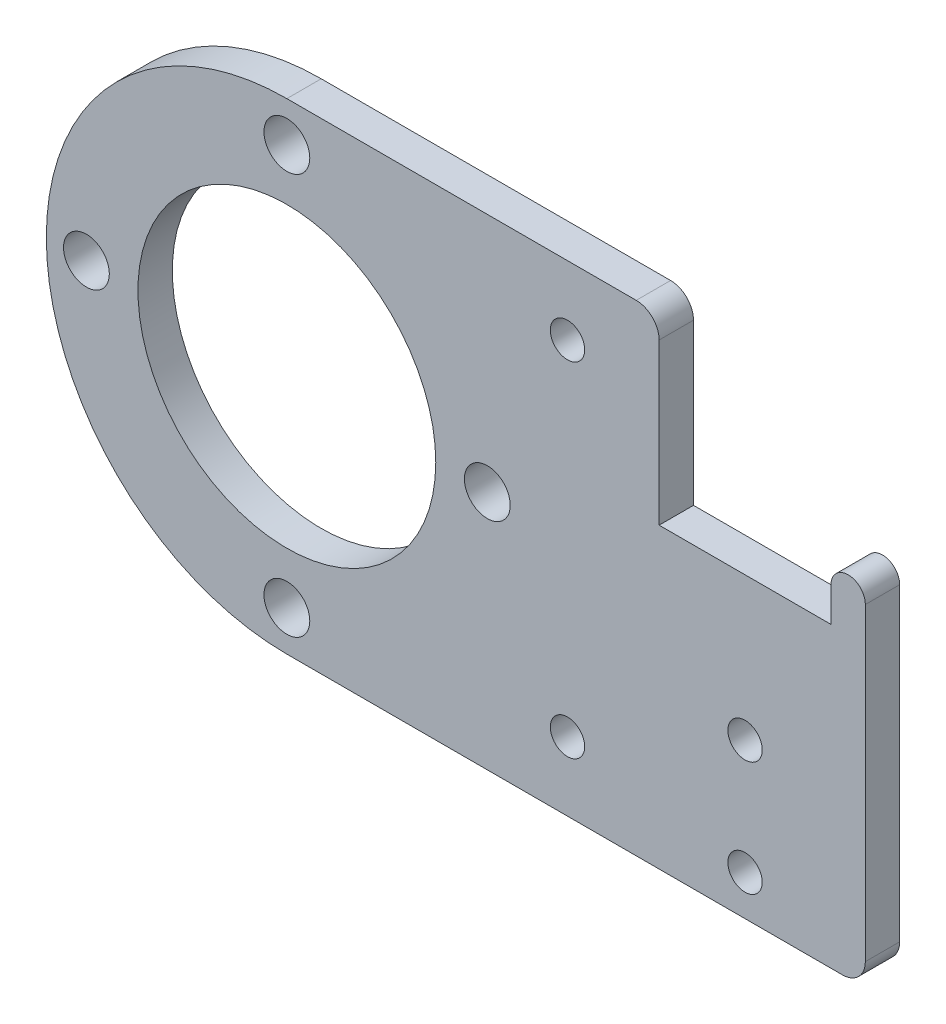
ISO-10303-21;
HEADER;
FILE_DESCRIPTION(('STEP AP214'),'2;1');
FILE_NAME('part.step','',(''),(''),'','','');
FILE_SCHEMA(('AUTOMOTIVE_DESIGN { 1 0 10303 214 1 1 1 1 }'));
ENDSEC;
DATA;
#1=APPLICATION_CONTEXT('core data for automotive mechanical design processes');
#2=APPLICATION_PROTOCOL_DEFINITION('international standard','automotive_design',2000,#1);
#3=PRODUCT_CONTEXT('',#1,'mechanical');
#4=PRODUCT('Part','Part','',(#3));
#5=PRODUCT_RELATED_PRODUCT_CATEGORY('part','',(#4));
#6=PRODUCT_DEFINITION_FORMATION('','',#4);
#7=PRODUCT_DEFINITION_CONTEXT('part definition',#1,'design');
#8=PRODUCT_DEFINITION('design','',#6,#7);
#9=PRODUCT_DEFINITION_SHAPE('','',#8);
#10=(LENGTH_UNIT() NAMED_UNIT(*) SI_UNIT(.MILLI.,.METRE.));
#11=(NAMED_UNIT(*) PLANE_ANGLE_UNIT() SI_UNIT($,.RADIAN.));
#12=(NAMED_UNIT(*) SI_UNIT($,.STERADIAN.) SOLID_ANGLE_UNIT());
#13=UNCERTAINTY_MEASURE_WITH_UNIT(LENGTH_MEASURE(1.E-05),#10,'distance_accuracy_value','');
#14=(GEOMETRIC_REPRESENTATION_CONTEXT(3) GLOBAL_UNCERTAINTY_ASSIGNED_CONTEXT((#13)) GLOBAL_UNIT_ASSIGNED_CONTEXT((#10,
#11,#12)) REPRESENTATION_CONTEXT('',''));
#15=CARTESIAN_POINT('',(0.,0.,0.));
#16=DIRECTION('',(0.,0.,1.));
#17=DIRECTION('',(1.,0.,0.));
#18=AXIS2_PLACEMENT_3D('',#15,#16,#17);
#19=CARTESIAN_POINT('',(0.,0.,3.));
#20=DIRECTION('',(0.,0.,1.));
#21=DIRECTION('',(1.,0.,0.));
#22=AXIS2_PLACEMENT_3D('',#19,#20,#21);
#23=PLANE('',#22);
#24=CARTESIAN_POINT('',(24.5,15.,3.));
#25=DIRECTION('',(0.,0.,1.));
#26=DIRECTION('',(1.,0.,0.));
#27=AXIS2_PLACEMENT_3D('',#24,#25,#26);
#28=CIRCLE('',#27,1.5);
#29=CARTESIAN_POINT('',(26.,15.,3.));
#30=VERTEX_POINT('',#29);
#31=EDGE_CURVE('E248',#30,#30,#28,.T.);
#32=ORIENTED_EDGE('',*,*,#31,.F.);
#33=EDGE_LOOP('',(#32));
#34=FACE_BOUND('',#33,.T.);
#35=CARTESIAN_POINT('',(40.,-7.5,3.));
#36=DIRECTION('',(0.,0.,1.));
#37=DIRECTION('',(1.,0.,0.));
#38=AXIS2_PLACEMENT_3D('',#35,#36,#37);
#39=CIRCLE('',#38,1.5);
#40=CARTESIAN_POINT('',(41.5,-7.5,3.));
#41=VERTEX_POINT('',#40);
#42=EDGE_CURVE('E236',#41,#41,#39,.T.);
#43=ORIENTED_EDGE('',*,*,#42,.F.);
#44=EDGE_LOOP('',(#43));
#45=FACE_BOUND('',#44,.T.);
#46=CARTESIAN_POINT('',(-17.5,0.,3.));
#47=DIRECTION('',(0.,0.,1.));
#48=DIRECTION('',(1.,0.,0.));
#49=AXIS2_PLACEMENT_3D('',#46,#47,#48);
#50=CIRCLE('',#49,2.);
#51=CARTESIAN_POINT('',(-15.5,0.,3.));
#52=VERTEX_POINT('',#51);
#53=EDGE_CURVE('E224',#52,#52,#50,.T.);
#54=ORIENTED_EDGE('',*,*,#53,.F.);
#55=EDGE_LOOP('',(#54));
#56=FACE_BOUND('',#55,.T.);
#57=CARTESIAN_POINT('',(17.5,0.,3.));
#58=DIRECTION('',(0.,0.,1.));
#59=DIRECTION('',(1.,0.,0.));
#60=AXIS2_PLACEMENT_3D('',#57,#58,#59);
#61=CIRCLE('',#60,2.);
#62=CARTESIAN_POINT('',(19.5,0.,3.));
#63=VERTEX_POINT('',#62);
#64=EDGE_CURVE('E212',#63,#63,#61,.T.);
#65=ORIENTED_EDGE('',*,*,#64,.F.);
#66=EDGE_LOOP('',(#65));
#67=FACE_BOUND('',#66,.T.);
#68=DIRECTION('',(1.,0.,0.));
#69=VECTOR('',#68,1.);
#70=CARTESIAN_POINT('',(50.5,-21.,3.));
#71=LINE('',#70,#69);
#72=CARTESIAN_POINT('',(0.,-21.,3.));
#73=VERTEX_POINT('',#72);
#74=CARTESIAN_POINT('',(48.5,-21.,3.));
#75=VERTEX_POINT('',#74);
#76=EDGE_CURVE('E112',#73,#75,#71,.T.);
#77=ORIENTED_EDGE('',*,*,#76,.T.);
#78=CARTESIAN_POINT('',(48.5,-19.,3.));
#79=DIRECTION('',(0.,0.,1.));
#80=DIRECTION('',(1.,0.,0.));
#81=AXIS2_PLACEMENT_3D('',#78,#79,#80);
#82=CIRCLE('',#81,2.);
#83=CARTESIAN_POINT('',(50.5,-19.,3.));
#84=VERTEX_POINT('',#83);
#85=EDGE_CURVE('E152',#75,#84,#82,.T.);
#86=ORIENTED_EDGE('',*,*,#85,.T.);
#87=DIRECTION('',(0.,1.,0.));
#88=VECTOR('',#87,1.);
#89=CARTESIAN_POINT('',(50.5,8.,3.));
#90=LINE('',#89,#88);
#91=CARTESIAN_POINT('',(50.5,8.,3.));
#92=VERTEX_POINT('',#91);
#93=EDGE_CURVE('E122',#84,#92,#90,.T.);
#94=ORIENTED_EDGE('',*,*,#93,.T.);
#95=CARTESIAN_POINT('',(49.,8.,3.));
#96=DIRECTION('',(0.,0.,1.));
#97=DIRECTION('',(-1.,0.,0.));
#98=AXIS2_PLACEMENT_3D('',#95,#96,#97);
#99=CIRCLE('',#98,1.5);
#100=CARTESIAN_POINT('',(47.5,8.,3.));
#101=VERTEX_POINT('',#100);
#102=EDGE_CURVE('E206',#92,#101,#99,.T.);
#103=ORIENTED_EDGE('',*,*,#102,.T.);
#104=DIRECTION('',(0.,-1.,0.));
#105=VECTOR('',#104,1.);
#106=CARTESIAN_POINT('',(47.5,5.,3.));
#107=LINE('',#106,#105);
#108=CARTESIAN_POINT('',(47.5,5.,3.));
#109=VERTEX_POINT('',#108);
#110=EDGE_CURVE('E185',#101,#109,#107,.T.);
#111=ORIENTED_EDGE('',*,*,#110,.T.);
#112=DIRECTION('',(-1.,0.,0.));
#113=VECTOR('',#112,1.);
#114=CARTESIAN_POINT('',(32.5,5.,3.));
#115=LINE('',#114,#113);
#116=CARTESIAN_POINT('',(32.5,5.,3.));
#117=VERTEX_POINT('',#116);
#118=EDGE_CURVE('E203',#109,#117,#115,.T.);
#119=ORIENTED_EDGE('',*,*,#118,.T.);
#120=DIRECTION('',(0.,1.,0.));
#121=VECTOR('',#120,1.);
#122=CARTESIAN_POINT('',(32.5,21.,3.));
#123=LINE('',#122,#121);
#124=CARTESIAN_POINT('',(32.5,19.,3.));
#125=VERTEX_POINT('',#124);
#126=EDGE_CURVE('E201',#117,#125,#123,.T.);
#127=ORIENTED_EDGE('',*,*,#126,.T.);
#128=CARTESIAN_POINT('',(30.5,19.,3.));
#129=DIRECTION('',(0.,0.,1.));
#130=DIRECTION('',(1.,0.,0.));
#131=AXIS2_PLACEMENT_3D('',#128,#129,#130);
#132=CIRCLE('',#131,2.);
#133=CARTESIAN_POINT('',(30.5,21.,3.));
#134=VERTEX_POINT('',#133);
#135=EDGE_CURVE('E50',#125,#134,#132,.T.);
#136=ORIENTED_EDGE('',*,*,#135,.T.);
#137=DIRECTION('',(-1.,0.,0.));
#138=VECTOR('',#137,1.);
#139=CARTESIAN_POINT('',(0.,21.,3.));
#140=LINE('',#139,#138);
#141=CARTESIAN_POINT('',(0.,21.,3.));
#142=VERTEX_POINT('',#141);
#143=EDGE_CURVE('E127',#134,#142,#140,.T.);
#144=ORIENTED_EDGE('',*,*,#143,.T.);
#145=CARTESIAN_POINT('',(0.,0.,3.));
#146=DIRECTION('',(0.,0.,1.));
#147=DIRECTION('',(1.,0.,0.));
#148=AXIS2_PLACEMENT_3D('',#145,#146,#147);
#149=CIRCLE('',#148,21.);
#150=EDGE_CURVE('E123',#142,#73,#149,.T.);
#151=ORIENTED_EDGE('',*,*,#150,.T.);
#152=EDGE_LOOP('',(#77,#86,#94,#103,#111,#119,#127,#136,#144,#151));
#153=FACE_BOUND('',#152,.T.);
#154=CARTESIAN_POINT('',(0.,0.,3.));
#155=DIRECTION('',(0.,0.,1.));
#156=DIRECTION('',(1.,0.,0.));
#157=AXIS2_PLACEMENT_3D('',#154,#155,#156);
#158=CIRCLE('',#157,13.);
#159=CARTESIAN_POINT('',(13.,0.,3.));
#160=VERTEX_POINT('',#159);
#161=EDGE_CURVE('E199',#160,#160,#158,.T.);
#162=ORIENTED_EDGE('',*,*,#161,.F.);
#163=EDGE_LOOP('',(#162));
#164=FACE_BOUND('',#163,.T.);
#165=CARTESIAN_POINT('',(0.,-17.5,3.));
#166=DIRECTION('',(0.,0.,1.));
#167=DIRECTION('',(1.,0.,0.));
#168=AXIS2_PLACEMENT_3D('',#165,#166,#167);
#169=CIRCLE('',#168,2.);
#170=CARTESIAN_POINT('',(2.,-17.5,3.));
#171=VERTEX_POINT('',#170);
#172=EDGE_CURVE('E218',#171,#171,#169,.T.);
#173=ORIENTED_EDGE('',*,*,#172,.F.);
#174=EDGE_LOOP('',(#173));
#175=FACE_BOUND('',#174,.T.);
#176=CARTESIAN_POINT('',(0.,17.5,3.));
#177=DIRECTION('',(0.,0.,1.));
#178=DIRECTION('',(1.,0.,0.));
#179=AXIS2_PLACEMENT_3D('',#176,#177,#178);
#180=CIRCLE('',#179,2.);
#181=CARTESIAN_POINT('',(2.,17.5,3.));
#182=VERTEX_POINT('',#181);
#183=EDGE_CURVE('E230',#182,#182,#180,.T.);
#184=ORIENTED_EDGE('',*,*,#183,.F.);
#185=EDGE_LOOP('',(#184));
#186=FACE_BOUND('',#185,.T.);
#187=CARTESIAN_POINT('',(40.,-17.5,3.));
#188=DIRECTION('',(0.,0.,1.));
#189=DIRECTION('',(1.,0.,0.));
#190=AXIS2_PLACEMENT_3D('',#187,#188,#189);
#191=CIRCLE('',#190,1.5);
#192=CARTESIAN_POINT('',(41.5,-17.5,3.));
#193=VERTEX_POINT('',#192);
#194=EDGE_CURVE('E242',#193,#193,#191,.T.);
#195=ORIENTED_EDGE('',*,*,#194,.F.);
#196=EDGE_LOOP('',(#195));
#197=FACE_BOUND('',#196,.T.);
#198=CARTESIAN_POINT('',(24.5,-15.,3.));
#199=DIRECTION('',(0.,0.,1.));
#200=DIRECTION('',(1.,0.,0.));
#201=AXIS2_PLACEMENT_3D('',#198,#199,#200);
#202=CIRCLE('',#201,1.5);
#203=CARTESIAN_POINT('',(26.,-15.,3.));
#204=VERTEX_POINT('',#203);
#205=EDGE_CURVE('E254',#204,#204,#202,.T.);
#206=ORIENTED_EDGE('',*,*,#205,.F.);
#207=EDGE_LOOP('',(#206));
#208=FACE_BOUND('',#207,.T.);
#209=ADVANCED_FACE('F35',(#34,#45,#56,#67,#153,#164,#175,#186,#197,#208),#23,.T.);
#210=CARTESIAN_POINT('',(0.,0.,0.));
#211=DIRECTION('',(0.,0.,1.));
#212=DIRECTION('',(1.,0.,0.));
#213=AXIS2_PLACEMENT_3D('',#210,#211,#212);
#214=PLANE('',#213);
#215=DIRECTION('',(0.,1.,0.));
#216=VECTOR('',#215,1.);
#217=CARTESIAN_POINT('',(50.5,8.,0.));
#218=LINE('',#217,#216);
#219=CARTESIAN_POINT('',(50.5,-19.,0.));
#220=VERTEX_POINT('',#219);
#221=CARTESIAN_POINT('',(50.5,8.,0.));
#222=VERTEX_POINT('',#221);
#223=EDGE_CURVE('E192',#220,#222,#218,.T.);
#224=ORIENTED_EDGE('',*,*,#223,.F.);
#225=CARTESIAN_POINT('',(48.5,-19.,0.));
#226=DIRECTION('',(0.,0.,1.));
#227=DIRECTION('',(1.,0.,0.));
#228=AXIS2_PLACEMENT_3D('',#225,#226,#227);
#229=CIRCLE('',#228,2.);
#230=CARTESIAN_POINT('',(48.5,-21.,0.));
#231=VERTEX_POINT('',#230);
#232=EDGE_CURVE('E148',#220,#231,#229,.F.);
#233=ORIENTED_EDGE('',*,*,#232,.T.);
#234=DIRECTION('',(1.,0.,0.));
#235=VECTOR('',#234,1.);
#236=CARTESIAN_POINT('',(50.5,-21.,0.));
#237=LINE('',#236,#235);
#238=CARTESIAN_POINT('',(0.,-21.,0.));
#239=VERTEX_POINT('',#238);
#240=EDGE_CURVE('E196',#239,#231,#237,.T.);
#241=ORIENTED_EDGE('',*,*,#240,.F.);
#242=CARTESIAN_POINT('',(0.,0.,0.));
#243=DIRECTION('',(0.,0.,1.));
#244=DIRECTION('',(1.,0.,0.));
#245=AXIS2_PLACEMENT_3D('',#242,#243,#244);
#246=CIRCLE('',#245,21.);
#247=CARTESIAN_POINT('',(0.,21.,0.));
#248=VERTEX_POINT('',#247);
#249=EDGE_CURVE('E135',#248,#239,#246,.T.);
#250=ORIENTED_EDGE('',*,*,#249,.F.);
#251=DIRECTION('',(-1.,0.,0.));
#252=VECTOR('',#251,1.);
#253=CARTESIAN_POINT('',(0.,21.,0.));
#254=LINE('',#253,#252);
#255=CARTESIAN_POINT('',(30.5,21.,0.));
#256=VERTEX_POINT('',#255);
#257=EDGE_CURVE('E131',#256,#248,#254,.T.);
#258=ORIENTED_EDGE('',*,*,#257,.F.);
#259=CARTESIAN_POINT('',(30.5,19.,0.));
#260=DIRECTION('',(0.,0.,1.));
#261=DIRECTION('',(1.,0.,0.));
#262=AXIS2_PLACEMENT_3D('',#259,#260,#261);
#263=CIRCLE('',#262,2.);
#264=CARTESIAN_POINT('',(32.5,19.,0.));
#265=VERTEX_POINT('',#264);
#266=EDGE_CURVE('E140',#256,#265,#263,.F.);
#267=ORIENTED_EDGE('',*,*,#266,.T.);
#268=DIRECTION('',(0.,1.,0.));
#269=VECTOR('',#268,1.);
#270=CARTESIAN_POINT('',(32.5,21.,0.));
#271=LINE('',#270,#269);
#272=CARTESIAN_POINT('',(32.5,5.,0.));
#273=VERTEX_POINT('',#272);
#274=EDGE_CURVE('E164',#273,#265,#271,.T.);
#275=ORIENTED_EDGE('',*,*,#274,.F.);
#276=DIRECTION('',(-1.,0.,0.));
#277=VECTOR('',#276,1.);
#278=CARTESIAN_POINT('',(32.5,5.,0.));
#279=LINE('',#278,#277);
#280=CARTESIAN_POINT('',(47.5,5.,0.));
#281=VERTEX_POINT('',#280);
#282=EDGE_CURVE('E166',#281,#273,#279,.T.);
#283=ORIENTED_EDGE('',*,*,#282,.F.);
#284=DIRECTION('',(0.,-1.,0.));
#285=VECTOR('',#284,1.);
#286=CARTESIAN_POINT('',(47.5,5.,0.));
#287=LINE('',#286,#285);
#288=CARTESIAN_POINT('',(47.5,8.,0.));
#289=VERTEX_POINT('',#288);
#290=EDGE_CURVE('E184',#289,#281,#287,.T.);
#291=ORIENTED_EDGE('',*,*,#290,.F.);
#292=CARTESIAN_POINT('',(49.,8.,0.));
#293=DIRECTION('',(0.,0.,1.));
#294=DIRECTION('',(-1.,0.,0.));
#295=AXIS2_PLACEMENT_3D('',#292,#293,#294);
#296=CIRCLE('',#295,1.5);
#297=EDGE_CURVE('E190',#222,#289,#296,.T.);
#298=ORIENTED_EDGE('',*,*,#297,.F.);
#299=EDGE_LOOP('',(#224,#233,#241,#250,#258,#267,#275,#283,#291,#298));
#300=FACE_BOUND('',#299,.T.);
#301=CARTESIAN_POINT('',(0.,0.,0.));
#302=DIRECTION('',(0.,0.,1.));
#303=DIRECTION('',(1.,0.,0.));
#304=AXIS2_PLACEMENT_3D('',#301,#302,#303);
#305=CIRCLE('',#304,13.);
#306=CARTESIAN_POINT('',(13.,0.,0.));
#307=VERTEX_POINT('',#306);
#308=EDGE_CURVE('E209',#307,#307,#305,.T.);
#309=ORIENTED_EDGE('',*,*,#308,.T.);
#310=EDGE_LOOP('',(#309));
#311=FACE_BOUND('',#310,.T.);
#312=CARTESIAN_POINT('',(17.5,0.,0.));
#313=DIRECTION('',(0.,0.,1.));
#314=DIRECTION('',(1.,0.,0.));
#315=AXIS2_PLACEMENT_3D('',#312,#313,#314);
#316=CIRCLE('',#315,2.);
#317=CARTESIAN_POINT('',(19.5,0.,0.));
#318=VERTEX_POINT('',#317);
#319=EDGE_CURVE('E215',#318,#318,#316,.T.);
#320=ORIENTED_EDGE('',*,*,#319,.T.);
#321=EDGE_LOOP('',(#320));
#322=FACE_BOUND('',#321,.T.);
#323=CARTESIAN_POINT('',(0.,-17.5,0.));
#324=DIRECTION('',(0.,0.,1.));
#325=DIRECTION('',(1.,0.,0.));
#326=AXIS2_PLACEMENT_3D('',#323,#324,#325);
#327=CIRCLE('',#326,2.);
#328=CARTESIAN_POINT('',(2.,-17.5,0.));
#329=VERTEX_POINT('',#328);
#330=EDGE_CURVE('E221',#329,#329,#327,.T.);
#331=ORIENTED_EDGE('',*,*,#330,.T.);
#332=EDGE_LOOP('',(#331));
#333=FACE_BOUND('',#332,.T.);
#334=CARTESIAN_POINT('',(-17.5,0.,0.));
#335=DIRECTION('',(0.,0.,1.));
#336=DIRECTION('',(1.,0.,0.));
#337=AXIS2_PLACEMENT_3D('',#334,#335,#336);
#338=CIRCLE('',#337,2.);
#339=CARTESIAN_POINT('',(-15.5,0.,0.));
#340=VERTEX_POINT('',#339);
#341=EDGE_CURVE('E227',#340,#340,#338,.T.);
#342=ORIENTED_EDGE('',*,*,#341,.T.);
#343=EDGE_LOOP('',(#342));
#344=FACE_BOUND('',#343,.T.);
#345=CARTESIAN_POINT('',(0.,17.5,0.));
#346=DIRECTION('',(0.,0.,1.));
#347=DIRECTION('',(1.,0.,0.));
#348=AXIS2_PLACEMENT_3D('',#345,#346,#347);
#349=CIRCLE('',#348,2.);
#350=CARTESIAN_POINT('',(2.,17.5,0.));
#351=VERTEX_POINT('',#350);
#352=EDGE_CURVE('E233',#351,#351,#349,.T.);
#353=ORIENTED_EDGE('',*,*,#352,.T.);
#354=EDGE_LOOP('',(#353));
#355=FACE_BOUND('',#354,.T.);
#356=CARTESIAN_POINT('',(40.,-7.5,0.));
#357=DIRECTION('',(0.,0.,1.));
#358=DIRECTION('',(1.,0.,0.));
#359=AXIS2_PLACEMENT_3D('',#356,#357,#358);
#360=CIRCLE('',#359,1.5);
#361=CARTESIAN_POINT('',(41.5,-7.5,0.));
#362=VERTEX_POINT('',#361);
#363=EDGE_CURVE('E239',#362,#362,#360,.T.);
#364=ORIENTED_EDGE('',*,*,#363,.T.);
#365=EDGE_LOOP('',(#364));
#366=FACE_BOUND('',#365,.T.);
#367=CARTESIAN_POINT('',(40.,-17.5,0.));
#368=DIRECTION('',(0.,0.,1.));
#369=DIRECTION('',(1.,0.,0.));
#370=AXIS2_PLACEMENT_3D('',#367,#368,#369);
#371=CIRCLE('',#370,1.5);
#372=CARTESIAN_POINT('',(41.5,-17.5,0.));
#373=VERTEX_POINT('',#372);
#374=EDGE_CURVE('E245',#373,#373,#371,.T.);
#375=ORIENTED_EDGE('',*,*,#374,.T.);
#376=EDGE_LOOP('',(#375));
#377=FACE_BOUND('',#376,.T.);
#378=CARTESIAN_POINT('',(24.5,15.,0.));
#379=DIRECTION('',(0.,0.,1.));
#380=DIRECTION('',(1.,0.,0.));
#381=AXIS2_PLACEMENT_3D('',#378,#379,#380);
#382=CIRCLE('',#381,1.5);
#383=CARTESIAN_POINT('',(26.,15.,0.));
#384=VERTEX_POINT('',#383);
#385=EDGE_CURVE('E251',#384,#384,#382,.T.);
#386=ORIENTED_EDGE('',*,*,#385,.T.);
#387=EDGE_LOOP('',(#386));
#388=FACE_BOUND('',#387,.T.);
#389=CARTESIAN_POINT('',(24.5,-15.,0.));
#390=DIRECTION('',(0.,0.,1.));
#391=DIRECTION('',(1.,0.,0.));
#392=AXIS2_PLACEMENT_3D('',#389,#390,#391);
#393=CIRCLE('',#392,1.5);
#394=CARTESIAN_POINT('',(26.,-15.,0.));
#395=VERTEX_POINT('',#394);
#396=EDGE_CURVE('E257',#395,#395,#393,.T.);
#397=ORIENTED_EDGE('',*,*,#396,.T.);
#398=EDGE_LOOP('',(#397));
#399=FACE_BOUND('',#398,.T.);
#400=ADVANCED_FACE('F161',(#300,#311,#322,#333,#344,#355,#366,#377,#388,#399),#214,.F.);
#401=CARTESIAN_POINT('',(0.,0.,3.));
#402=DIRECTION('',(0.,0.,-1.));
#403=DIRECTION('',(-1.,0.,0.));
#404=AXIS2_PLACEMENT_3D('',#401,#402,#403);
#405=CYLINDRICAL_SURFACE('',#404,21.);
#406=ORIENTED_EDGE('',*,*,#249,.T.);
#407=DIRECTION('',(0.,0.,-1.));
#408=VECTOR('',#407,1.);
#409=CARTESIAN_POINT('',(0.,-21.,3.));
#410=LINE('',#409,#408);
#411=EDGE_CURVE('E117',#73,#239,#410,.T.);
#412=ORIENTED_EDGE('',*,*,#411,.F.);
#413=ORIENTED_EDGE('',*,*,#150,.F.);
#414=DIRECTION('',(0.,0.,-1.));
#415=VECTOR('',#414,1.);
#416=CARTESIAN_POINT('',(0.,21.,3.));
#417=LINE('',#416,#415);
#418=EDGE_CURVE('E170',#142,#248,#417,.T.);
#419=ORIENTED_EDGE('',*,*,#418,.T.);
#420=EDGE_LOOP('',(#406,#412,#413,#419));
#421=FACE_BOUND('',#420,.T.);
#422=ADVANCED_FACE('F133',(#421),#405,.T.);
#423=CARTESIAN_POINT('',(50.5,-21.,3.));
#424=DIRECTION('',(0.,1.,0.));
#425=DIRECTION('',(-1.,0.,0.));
#426=AXIS2_PLACEMENT_3D('',#423,#424,#425);
#427=PLANE('',#426);
#428=ORIENTED_EDGE('',*,*,#240,.T.);
#429=DIRECTION('',(0.,0.,-1.));
#430=VECTOR('',#429,1.);
#431=CARTESIAN_POINT('',(48.5,-21.,3.));
#432=LINE('',#431,#430);
#433=EDGE_CURVE('E120',#231,#75,#432,.F.);
#434=ORIENTED_EDGE('',*,*,#433,.T.);
#435=ORIENTED_EDGE('',*,*,#76,.F.);
#436=ORIENTED_EDGE('',*,*,#411,.T.);
#437=EDGE_LOOP('',(#428,#434,#435,#436));
#438=FACE_BOUND('',#437,.T.);
#439=ADVANCED_FACE('F115',(#438),#427,.F.);
#440=CARTESIAN_POINT('',(50.5,8.,3.));
#441=DIRECTION('',(-1.,0.,0.));
#442=DIRECTION('',(0.,-1.,0.));
#443=AXIS2_PLACEMENT_3D('',#440,#441,#442);
#444=PLANE('',#443);
#445=ORIENTED_EDGE('',*,*,#93,.F.);
#446=DIRECTION('',(0.,0.,-1.));
#447=VECTOR('',#446,1.);
#448=CARTESIAN_POINT('',(50.5,-19.,3.));
#449=LINE('',#448,#447);
#450=EDGE_CURVE('E136',#84,#220,#449,.T.);
#451=ORIENTED_EDGE('',*,*,#450,.T.);
#452=ORIENTED_EDGE('',*,*,#223,.T.);
#453=DIRECTION('',(0.,0.,-1.));
#454=VECTOR('',#453,1.);
#455=CARTESIAN_POINT('',(50.5,8.,3.));
#456=LINE('',#455,#454);
#457=EDGE_CURVE('E137',#92,#222,#456,.T.);
#458=ORIENTED_EDGE('',*,*,#457,.F.);
#459=EDGE_LOOP('',(#445,#451,#452,#458));
#460=FACE_BOUND('',#459,.T.);
#461=ADVANCED_FACE('F293',(#460),#444,.F.);
#462=CARTESIAN_POINT('',(49.,8.,3.));
#463=DIRECTION('',(0.,0.,-1.));
#464=DIRECTION('',(-1.,0.,0.));
#465=AXIS2_PLACEMENT_3D('',#462,#463,#464);
#466=CYLINDRICAL_SURFACE('',#465,1.5);
#467=ORIENTED_EDGE('',*,*,#297,.T.);
#468=DIRECTION('',(0.,0.,-1.));
#469=VECTOR('',#468,1.);
#470=CARTESIAN_POINT('',(47.5,8.,3.));
#471=LINE('',#470,#469);
#472=EDGE_CURVE('E143',#101,#289,#471,.T.);
#473=ORIENTED_EDGE('',*,*,#472,.F.);
#474=ORIENTED_EDGE('',*,*,#102,.F.);
#475=ORIENTED_EDGE('',*,*,#457,.T.);
#476=EDGE_LOOP('',(#467,#473,#474,#475));
#477=FACE_BOUND('',#476,.T.);
#478=ADVANCED_FACE('F290',(#477),#466,.T.);
#479=CARTESIAN_POINT('',(47.5,5.,3.));
#480=DIRECTION('',(1.,0.,0.));
#481=DIRECTION('',(0.,1.,0.));
#482=AXIS2_PLACEMENT_3D('',#479,#480,#481);
#483=PLANE('',#482);
#484=ORIENTED_EDGE('',*,*,#290,.T.);
#485=DIRECTION('',(0.,0.,-1.));
#486=VECTOR('',#485,1.);
#487=CARTESIAN_POINT('',(47.5,5.,3.));
#488=LINE('',#487,#486);
#489=EDGE_CURVE('E175',#109,#281,#488,.T.);
#490=ORIENTED_EDGE('',*,*,#489,.F.);
#491=ORIENTED_EDGE('',*,*,#110,.F.);
#492=ORIENTED_EDGE('',*,*,#472,.T.);
#493=EDGE_LOOP('',(#484,#490,#491,#492));
#494=FACE_BOUND('',#493,.T.);
#495=ADVANCED_FACE('F182',(#494),#483,.F.);
#496=CARTESIAN_POINT('',(32.5,5.,3.));
#497=DIRECTION('',(0.,-1.,0.));
#498=DIRECTION('',(1.,0.,0.));
#499=AXIS2_PLACEMENT_3D('',#496,#497,#498);
#500=PLANE('',#499);
#501=ORIENTED_EDGE('',*,*,#282,.T.);
#502=DIRECTION('',(0.,0.,-1.));
#503=VECTOR('',#502,1.);
#504=CARTESIAN_POINT('',(32.5,5.,3.));
#505=LINE('',#504,#503);
#506=EDGE_CURVE('E172',#117,#273,#505,.T.);
#507=ORIENTED_EDGE('',*,*,#506,.F.);
#508=ORIENTED_EDGE('',*,*,#118,.F.);
#509=ORIENTED_EDGE('',*,*,#489,.T.);
#510=EDGE_LOOP('',(#501,#507,#508,#509));
#511=FACE_BOUND('',#510,.T.);
#512=ADVANCED_FACE('F284',(#511),#500,.F.);
#513=CARTESIAN_POINT('',(32.5,21.,3.));
#514=DIRECTION('',(-1.,0.,0.));
#515=DIRECTION('',(0.,0.,1.));
#516=AXIS2_PLACEMENT_3D('',#513,#514,#515);
#517=PLANE('',#516);
#518=ORIENTED_EDGE('',*,*,#274,.T.);
#519=DIRECTION('',(0.,0.,-1.));
#520=VECTOR('',#519,1.);
#521=CARTESIAN_POINT('',(32.5,19.,3.));
#522=LINE('',#521,#520);
#523=EDGE_CURVE('E11',#265,#125,#522,.F.);
#524=ORIENTED_EDGE('',*,*,#523,.T.);
#525=ORIENTED_EDGE('',*,*,#126,.F.);
#526=ORIENTED_EDGE('',*,*,#506,.T.);
#527=EDGE_LOOP('',(#518,#524,#525,#526));
#528=FACE_BOUND('',#527,.T.);
#529=ADVANCED_FACE('F281',(#528),#517,.F.);
#530=CARTESIAN_POINT('',(0.,21.,3.));
#531=DIRECTION('',(0.,-1.,0.));
#532=DIRECTION('',(1.,0.,0.));
#533=AXIS2_PLACEMENT_3D('',#530,#531,#532);
#534=PLANE('',#533);
#535=ORIENTED_EDGE('',*,*,#143,.F.);
#536=DIRECTION('',(0.,0.,-1.));
#537=VECTOR('',#536,1.);
#538=CARTESIAN_POINT('',(30.5,21.,3.));
#539=LINE('',#538,#537);
#540=EDGE_CURVE('E43',#134,#256,#539,.T.);
#541=ORIENTED_EDGE('',*,*,#540,.T.);
#542=ORIENTED_EDGE('',*,*,#257,.T.);
#543=ORIENTED_EDGE('',*,*,#418,.F.);
#544=EDGE_LOOP('',(#535,#541,#542,#543));
#545=FACE_BOUND('',#544,.T.);
#546=ADVANCED_FACE('F157',(#545),#534,.F.);
#547=CARTESIAN_POINT('',(0.,0.,3.));
#548=DIRECTION('',(0.,0.,-1.));
#549=DIRECTION('',(-1.,0.,0.));
#550=AXIS2_PLACEMENT_3D('',#547,#548,#549);
#551=CYLINDRICAL_SURFACE('',#550,13.);
#552=ORIENTED_EDGE('',*,*,#161,.T.);
#553=EDGE_LOOP('',(#552));
#554=FACE_BOUND('',#553,.T.);
#555=ORIENTED_EDGE('',*,*,#308,.F.);
#556=EDGE_LOOP('',(#555));
#557=FACE_BOUND('',#556,.T.);
#558=ADVANCED_FACE('F276',(#554,#557),#551,.F.);
#559=CARTESIAN_POINT('',(17.5,0.,3.));
#560=DIRECTION('',(0.,0.,-1.));
#561=DIRECTION('',(-1.,0.,0.));
#562=AXIS2_PLACEMENT_3D('',#559,#560,#561);
#563=CYLINDRICAL_SURFACE('',#562,2.);
#564=ORIENTED_EDGE('',*,*,#64,.T.);
#565=EDGE_LOOP('',(#564));
#566=FACE_BOUND('',#565,.T.);
#567=ORIENTED_EDGE('',*,*,#319,.F.);
#568=EDGE_LOOP('',(#567));
#569=FACE_BOUND('',#568,.T.);
#570=ADVANCED_FACE('F338',(#566,#569),#563,.F.);
#571=CARTESIAN_POINT('',(0.,-17.5,3.));
#572=DIRECTION('',(0.,0.,-1.));
#573=DIRECTION('',(-1.,0.,0.));
#574=AXIS2_PLACEMENT_3D('',#571,#572,#573);
#575=CYLINDRICAL_SURFACE('',#574,2.);
#576=ORIENTED_EDGE('',*,*,#172,.T.);
#577=EDGE_LOOP('',(#576));
#578=FACE_BOUND('',#577,.T.);
#579=ORIENTED_EDGE('',*,*,#330,.F.);
#580=EDGE_LOOP('',(#579));
#581=FACE_BOUND('',#580,.T.);
#582=ADVANCED_FACE('F335',(#578,#581),#575,.F.);
#583=CARTESIAN_POINT('',(-17.5,0.,3.));
#584=DIRECTION('',(0.,0.,-1.));
#585=DIRECTION('',(-1.,0.,0.));
#586=AXIS2_PLACEMENT_3D('',#583,#584,#585);
#587=CYLINDRICAL_SURFACE('',#586,2.);
#588=ORIENTED_EDGE('',*,*,#53,.T.);
#589=EDGE_LOOP('',(#588));
#590=FACE_BOUND('',#589,.T.);
#591=ORIENTED_EDGE('',*,*,#341,.F.);
#592=EDGE_LOOP('',(#591));
#593=FACE_BOUND('',#592,.T.);
#594=ADVANCED_FACE('F331',(#590,#593),#587,.F.);
#595=CARTESIAN_POINT('',(0.,17.5,3.));
#596=DIRECTION('',(0.,0.,-1.));
#597=DIRECTION('',(-1.,0.,0.));
#598=AXIS2_PLACEMENT_3D('',#595,#596,#597);
#599=CYLINDRICAL_SURFACE('',#598,2.);
#600=ORIENTED_EDGE('',*,*,#183,.T.);
#601=EDGE_LOOP('',(#600));
#602=FACE_BOUND('',#601,.T.);
#603=ORIENTED_EDGE('',*,*,#352,.F.);
#604=EDGE_LOOP('',(#603));
#605=FACE_BOUND('',#604,.T.);
#606=ADVANCED_FACE('F327',(#602,#605),#599,.F.);
#607=CARTESIAN_POINT('',(40.,-7.5,3.));
#608=DIRECTION('',(0.,0.,-1.));
#609=DIRECTION('',(-1.,0.,0.));
#610=AXIS2_PLACEMENT_3D('',#607,#608,#609);
#611=CYLINDRICAL_SURFACE('',#610,1.5);
#612=ORIENTED_EDGE('',*,*,#42,.T.);
#613=EDGE_LOOP('',(#612));
#614=FACE_BOUND('',#613,.T.);
#615=ORIENTED_EDGE('',*,*,#363,.F.);
#616=EDGE_LOOP('',(#615));
#617=FACE_BOUND('',#616,.T.);
#618=ADVANCED_FACE('F323',(#614,#617),#611,.F.);
#619=CARTESIAN_POINT('',(40.,-17.5,3.));
#620=DIRECTION('',(0.,0.,-1.));
#621=DIRECTION('',(-1.,0.,0.));
#622=AXIS2_PLACEMENT_3D('',#619,#620,#621);
#623=CYLINDRICAL_SURFACE('',#622,1.5);
#624=ORIENTED_EDGE('',*,*,#194,.T.);
#625=EDGE_LOOP('',(#624));
#626=FACE_BOUND('',#625,.T.);
#627=ORIENTED_EDGE('',*,*,#374,.F.);
#628=EDGE_LOOP('',(#627));
#629=FACE_BOUND('',#628,.T.);
#630=ADVANCED_FACE('F317',(#626,#629),#623,.F.);
#631=CARTESIAN_POINT('',(24.5,15.,3.));
#632=DIRECTION('',(0.,0.,-1.));
#633=DIRECTION('',(-1.,0.,0.));
#634=AXIS2_PLACEMENT_3D('',#631,#632,#633);
#635=CYLINDRICAL_SURFACE('',#634,1.5);
#636=ORIENTED_EDGE('',*,*,#31,.T.);
#637=EDGE_LOOP('',(#636));
#638=FACE_BOUND('',#637,.T.);
#639=ORIENTED_EDGE('',*,*,#385,.F.);
#640=EDGE_LOOP('',(#639));
#641=FACE_BOUND('',#640,.T.);
#642=ADVANCED_FACE('F307',(#638,#641),#635,.F.);
#643=CARTESIAN_POINT('',(24.5,-15.,3.));
#644=DIRECTION('',(0.,0.,-1.));
#645=DIRECTION('',(-1.,0.,0.));
#646=AXIS2_PLACEMENT_3D('',#643,#644,#645);
#647=CYLINDRICAL_SURFACE('',#646,1.5);
#648=ORIENTED_EDGE('',*,*,#205,.T.);
#649=EDGE_LOOP('',(#648));
#650=FACE_BOUND('',#649,.T.);
#651=ORIENTED_EDGE('',*,*,#396,.F.);
#652=EDGE_LOOP('',(#651));
#653=FACE_BOUND('',#652,.T.);
#654=ADVANCED_FACE('F263',(#650,#653),#647,.F.);
#655=CARTESIAN_POINT('',(48.5,-19.,3.));
#656=DIRECTION('',(0.,0.,-1.));
#657=DIRECTION('',(-1.,0.,0.));
#658=AXIS2_PLACEMENT_3D('',#655,#656,#657);
#659=CYLINDRICAL_SURFACE('',#658,2.);
#660=ORIENTED_EDGE('',*,*,#85,.F.);
#661=ORIENTED_EDGE('',*,*,#433,.F.);
#662=ORIENTED_EDGE('',*,*,#232,.F.);
#663=ORIENTED_EDGE('',*,*,#450,.F.);
#664=EDGE_LOOP('',(#660,#661,#662,#663));
#665=FACE_BOUND('',#664,.T.);
#666=ADVANCED_FACE('F300',(#665),#659,.T.);
#667=CARTESIAN_POINT('',(30.5,19.,3.));
#668=DIRECTION('',(0.,0.,-1.));
#669=DIRECTION('',(-1.,0.,0.));
#670=AXIS2_PLACEMENT_3D('',#667,#668,#669);
#671=CYLINDRICAL_SURFACE('',#670,2.);
#672=ORIENTED_EDGE('',*,*,#135,.F.);
#673=ORIENTED_EDGE('',*,*,#523,.F.);
#674=ORIENTED_EDGE('',*,*,#266,.F.);
#675=ORIENTED_EDGE('',*,*,#540,.F.);
#676=EDGE_LOOP('',(#672,#673,#674,#675));
#677=FACE_BOUND('',#676,.T.);
#678=ADVANCED_FACE('F37',(#677),#671,.T.);
#679=CLOSED_SHELL('',(#209,#400,#422,#439,#461,#478,#495,#512,#529,#546,#558,#570,#582,#594,
#606,#618,#630,#642,#654,#666,#678));
#680=MANIFOLD_SOLID_BREP('B2',#679);
#681=ADVANCED_BREP_SHAPE_REPRESENTATION('',(#18,#680),#14);
#682=SHAPE_DEFINITION_REPRESENTATION(#9,#681);
ENDSEC;
END-ISO-10303-21;
